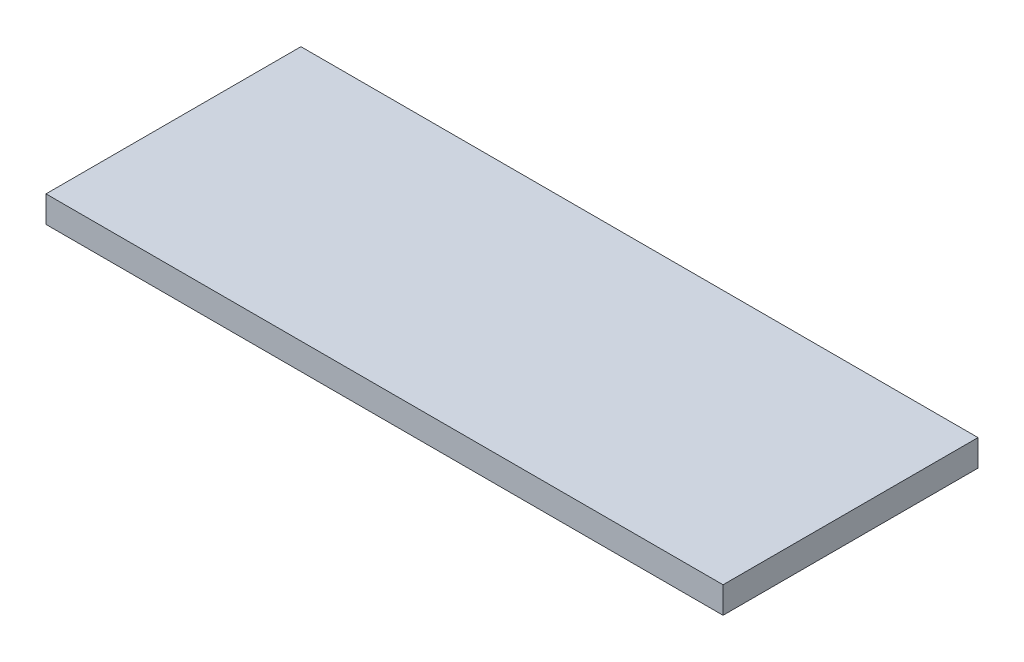
ISO-10303-21;
HEADER;
FILE_DESCRIPTION(('STEP AP214'),'2;1');
FILE_NAME('part.step','',(''),(''),'','','');
FILE_SCHEMA(('AUTOMOTIVE_DESIGN { 1 0 10303 214 1 1 1 1 }'));
ENDSEC;
DATA;
#1=APPLICATION_CONTEXT('core data for automotive mechanical design processes');
#2=APPLICATION_PROTOCOL_DEFINITION('international standard','automotive_design',2000,#1);
#3=PRODUCT_CONTEXT('',#1,'mechanical');
#4=PRODUCT('Part','Part','',(#3));
#5=PRODUCT_RELATED_PRODUCT_CATEGORY('part','',(#4));
#6=PRODUCT_DEFINITION_FORMATION('','',#4);
#7=PRODUCT_DEFINITION_CONTEXT('part definition',#1,'design');
#8=PRODUCT_DEFINITION('design','',#6,#7);
#9=PRODUCT_DEFINITION_SHAPE('','',#8);
#10=(LENGTH_UNIT() NAMED_UNIT(*) SI_UNIT(.MILLI.,.METRE.));
#11=(NAMED_UNIT(*) PLANE_ANGLE_UNIT() SI_UNIT($,.RADIAN.));
#12=(NAMED_UNIT(*) SI_UNIT($,.STERADIAN.) SOLID_ANGLE_UNIT());
#13=UNCERTAINTY_MEASURE_WITH_UNIT(LENGTH_MEASURE(1.E-05),#10,'distance_accuracy_value','');
#14=(GEOMETRIC_REPRESENTATION_CONTEXT(3) GLOBAL_UNCERTAINTY_ASSIGNED_CONTEXT((#13)) GLOBAL_UNIT_ASSIGNED_CONTEXT((#10,
#11,#12)) REPRESENTATION_CONTEXT('',''));
#15=CARTESIAN_POINT('',(0.,0.,0.));
#16=DIRECTION('',(0.,0.,1.));
#17=DIRECTION('',(1.,0.,0.));
#18=AXIS2_PLACEMENT_3D('',#15,#16,#17);
#19=CARTESIAN_POINT('',(-20.45,1.6,-7.7));
#20=DIRECTION('',(1.,0.,0.));
#21=DIRECTION('',(0.,0.,-1.));
#22=AXIS2_PLACEMENT_3D('',#19,#20,#21);
#23=PLANE('',#22);
#24=DIRECTION('',(0.,0.,1.));
#25=VECTOR('',#24,1.);
#26=CARTESIAN_POINT('',(-20.45,0.,-7.7));
#27=LINE('',#26,#25);
#28=CARTESIAN_POINT('',(-20.45,0.,-7.7));
#29=VERTEX_POINT('',#28);
#30=CARTESIAN_POINT('',(-20.45,0.,7.7));
#31=VERTEX_POINT('',#30);
#32=EDGE_CURVE('E105',#29,#31,#27,.T.);
#33=ORIENTED_EDGE('',*,*,#32,.T.);
#34=DIRECTION('',(0.,-1.,0.));
#35=VECTOR('',#34,1.);
#36=CARTESIAN_POINT('',(-20.45,1.6,7.7));
#37=LINE('',#36,#35);
#38=CARTESIAN_POINT('',(-20.45,1.6,7.7));
#39=VERTEX_POINT('',#38);
#40=EDGE_CURVE('E11',#39,#31,#37,.T.);
#41=ORIENTED_EDGE('',*,*,#40,.F.);
#42=DIRECTION('',(0.,0.,1.));
#43=VECTOR('',#42,1.);
#44=CARTESIAN_POINT('',(-20.45,1.6,-7.7));
#45=LINE('',#44,#43);
#46=CARTESIAN_POINT('',(-20.45,1.6,-7.7));
#47=VERTEX_POINT('',#46);
#48=EDGE_CURVE('E88',#47,#39,#45,.T.);
#49=ORIENTED_EDGE('',*,*,#48,.F.);
#50=DIRECTION('',(0.,-1.,0.));
#51=VECTOR('',#50,1.);
#52=CARTESIAN_POINT('',(-20.45,1.6,-7.7));
#53=LINE('',#52,#51);
#54=EDGE_CURVE('E101',#47,#29,#53,.T.);
#55=ORIENTED_EDGE('',*,*,#54,.T.);
#56=EDGE_LOOP('',(#33,#41,#49,#55));
#57=FACE_BOUND('',#56,.T.);
#58=ADVANCED_FACE('F36',(#57),#23,.F.);
#59=CARTESIAN_POINT('',(-20.45,1.6,7.7));
#60=DIRECTION('',(0.,0.,-1.));
#61=DIRECTION('',(-1.,0.,0.));
#62=AXIS2_PLACEMENT_3D('',#59,#60,#61);
#63=PLANE('',#62);
#64=DIRECTION('',(1.,0.,0.));
#65=VECTOR('',#64,1.);
#66=CARTESIAN_POINT('',(-20.45,0.,7.7));
#67=LINE('',#66,#65);
#68=CARTESIAN_POINT('',(20.45,0.,7.69999999999999));
#69=VERTEX_POINT('',#68);
#70=EDGE_CURVE('E93',#31,#69,#67,.T.);
#71=ORIENTED_EDGE('',*,*,#70,.T.);
#72=DIRECTION('',(0.,-1.,0.));
#73=VECTOR('',#72,1.);
#74=CARTESIAN_POINT('',(20.45,1.6,7.69999999999999));
#75=LINE('',#74,#73);
#76=CARTESIAN_POINT('',(20.45,1.6,7.69999999999999));
#77=VERTEX_POINT('',#76);
#78=EDGE_CURVE('E45',#77,#69,#75,.T.);
#79=ORIENTED_EDGE('',*,*,#78,.F.);
#80=DIRECTION('',(1.,0.,0.));
#81=VECTOR('',#80,1.);
#82=CARTESIAN_POINT('',(-20.45,1.6,7.7));
#83=LINE('',#82,#81);
#84=EDGE_CURVE('E83',#39,#77,#83,.T.);
#85=ORIENTED_EDGE('',*,*,#84,.F.);
#86=ORIENTED_EDGE('',*,*,#40,.T.);
#87=EDGE_LOOP('',(#71,#79,#85,#86));
#88=FACE_BOUND('',#87,.T.);
#89=ADVANCED_FACE('F92',(#88),#63,.F.);
#90=CARTESIAN_POINT('',(20.45,1.6,-7.7));
#91=DIRECTION('',(-1.,0.,0.));
#92=DIRECTION('',(0.,0.,1.));
#93=AXIS2_PLACEMENT_3D('',#90,#91,#92);
#94=PLANE('',#93);
#95=DIRECTION('',(0.,0.,-1.));
#96=VECTOR('',#95,1.);
#97=CARTESIAN_POINT('',(20.45,0.,-7.7));
#98=LINE('',#97,#96);
#99=CARTESIAN_POINT('',(20.45,0.,-7.7));
#100=VERTEX_POINT('',#99);
#101=EDGE_CURVE('E70',#69,#100,#98,.T.);
#102=ORIENTED_EDGE('',*,*,#101,.T.);
#103=DIRECTION('',(0.,-1.,0.));
#104=VECTOR('',#103,1.);
#105=CARTESIAN_POINT('',(20.45,1.6,-7.7));
#106=LINE('',#105,#104);
#107=CARTESIAN_POINT('',(20.45,1.6,-7.7));
#108=VERTEX_POINT('',#107);
#109=EDGE_CURVE('E95',#108,#100,#106,.T.);
#110=ORIENTED_EDGE('',*,*,#109,.F.);
#111=DIRECTION('',(0.,0.,-1.));
#112=VECTOR('',#111,1.);
#113=CARTESIAN_POINT('',(20.45,1.6,-7.7));
#114=LINE('',#113,#112);
#115=EDGE_CURVE('E86',#77,#108,#114,.T.);
#116=ORIENTED_EDGE('',*,*,#115,.F.);
#117=ORIENTED_EDGE('',*,*,#78,.T.);
#118=EDGE_LOOP('',(#102,#110,#116,#117));
#119=FACE_BOUND('',#118,.T.);
#120=ADVANCED_FACE('F96',(#119),#94,.F.);
#121=CARTESIAN_POINT('',(-20.45,1.6,-7.7));
#122=DIRECTION('',(0.,0.,1.));
#123=DIRECTION('',(1.,0.,0.));
#124=AXIS2_PLACEMENT_3D('',#121,#122,#123);
#125=PLANE('',#124);
#126=DIRECTION('',(-1.,0.,0.));
#127=VECTOR('',#126,1.);
#128=CARTESIAN_POINT('',(-20.45,0.,-7.7));
#129=LINE('',#128,#127);
#130=EDGE_CURVE('E76',#100,#29,#129,.T.);
#131=ORIENTED_EDGE('',*,*,#130,.T.);
#132=ORIENTED_EDGE('',*,*,#54,.F.);
#133=DIRECTION('',(-1.,0.,0.));
#134=VECTOR('',#133,1.);
#135=CARTESIAN_POINT('',(-20.45,1.6,-7.7));
#136=LINE('',#135,#134);
#137=EDGE_CURVE('E53',#108,#47,#136,.T.);
#138=ORIENTED_EDGE('',*,*,#137,.F.);
#139=ORIENTED_EDGE('',*,*,#109,.T.);
#140=EDGE_LOOP('',(#131,#132,#138,#139));
#141=FACE_BOUND('',#140,.T.);
#142=ADVANCED_FACE('F117',(#141),#125,.F.);
#143=CARTESIAN_POINT('',(0.,1.6,0.));
#144=DIRECTION('',(0.,1.,0.));
#145=DIRECTION('',(0.,0.,1.));
#146=AXIS2_PLACEMENT_3D('',#143,#144,#145);
#147=PLANE('',#146);
#148=ORIENTED_EDGE('',*,*,#48,.T.);
#149=ORIENTED_EDGE('',*,*,#84,.T.);
#150=ORIENTED_EDGE('',*,*,#115,.T.);
#151=ORIENTED_EDGE('',*,*,#137,.T.);
#152=EDGE_LOOP('',(#148,#149,#150,#151));
#153=FACE_BOUND('',#152,.T.);
#154=ADVANCED_FACE('F84',(#153),#147,.T.);
#155=CARTESIAN_POINT('',(0.,0.,0.));
#156=DIRECTION('',(0.,1.,0.));
#157=DIRECTION('',(0.,0.,1.));
#158=AXIS2_PLACEMENT_3D('',#155,#156,#157);
#159=PLANE('',#158);
#160=ORIENTED_EDGE('',*,*,#32,.F.);
#161=ORIENTED_EDGE('',*,*,#130,.F.);
#162=ORIENTED_EDGE('',*,*,#101,.F.);
#163=ORIENTED_EDGE('',*,*,#70,.F.);
#164=EDGE_LOOP('',(#160,#161,#162,#163));
#165=FACE_BOUND('',#164,.T.);
#166=ADVANCED_FACE('F120',(#165),#159,.F.);
#167=CLOSED_SHELL('',(#58,#89,#120,#142,#154,#166));
#168=MANIFOLD_SOLID_BREP('B2',#167);
#169=ADVANCED_BREP_SHAPE_REPRESENTATION('',(#18,#168),#14);
#170=SHAPE_DEFINITION_REPRESENTATION(#9,#169);
ENDSEC;
END-ISO-10303-21;
